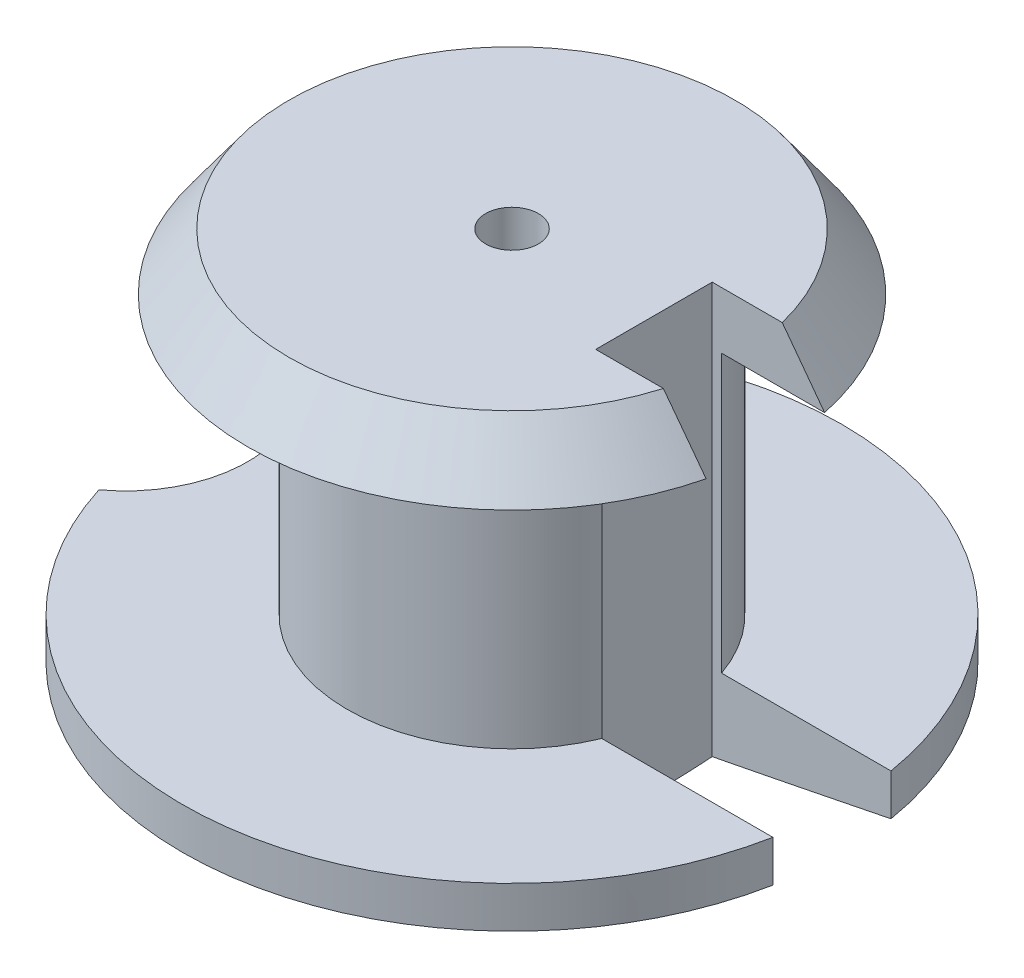
ISO-10303-21;
HEADER;
FILE_DESCRIPTION(('STEP AP214'),'2;1');
FILE_NAME('part.step','',(''),(''),'','','');
FILE_SCHEMA(('AUTOMOTIVE_DESIGN { 1 0 10303 214 1 1 1 1 }'));
ENDSEC;
DATA;
#1=APPLICATION_CONTEXT('core data for automotive mechanical design processes');
#2=APPLICATION_PROTOCOL_DEFINITION('international standard','automotive_design',2000,#1);
#3=PRODUCT_CONTEXT('',#1,'mechanical');
#4=PRODUCT('Part','Part','',(#3));
#5=PRODUCT_RELATED_PRODUCT_CATEGORY('part','',(#4));
#6=PRODUCT_DEFINITION_FORMATION('','',#4);
#7=PRODUCT_DEFINITION_CONTEXT('part definition',#1,'design');
#8=PRODUCT_DEFINITION('design','',#6,#7);
#9=PRODUCT_DEFINITION_SHAPE('','',#8);
#10=(LENGTH_UNIT() NAMED_UNIT(*) SI_UNIT(.MILLI.,.METRE.));
#11=(NAMED_UNIT(*) PLANE_ANGLE_UNIT() SI_UNIT($,.RADIAN.));
#12=(NAMED_UNIT(*) SI_UNIT($,.STERADIAN.) SOLID_ANGLE_UNIT());
#13=UNCERTAINTY_MEASURE_WITH_UNIT(LENGTH_MEASURE(1.E-05),#10,'distance_accuracy_value','');
#14=(GEOMETRIC_REPRESENTATION_CONTEXT(3) GLOBAL_UNCERTAINTY_ASSIGNED_CONTEXT((#13)) GLOBAL_UNIT_ASSIGNED_CONTEXT((#10,
#11,#12)) REPRESENTATION_CONTEXT('',''));
#15=CARTESIAN_POINT('',(0.,0.,0.));
#16=DIRECTION('',(0.,0.,1.));
#17=DIRECTION('',(1.,0.,0.));
#18=AXIS2_PLACEMENT_3D('',#15,#16,#17);
#19=CARTESIAN_POINT('',(0.,60.5928571428572,0.));
#20=DIRECTION('',(0.,1.,0.));
#21=DIRECTION('',(0.,0.,1.));
#22=AXIS2_PLACEMENT_3D('',#19,#20,#21);
#23=CYLINDRICAL_SURFACE('',#22,67.5801317233809);
#24=DIRECTION('',(0.,1.,0.));
#25=VECTOR('',#24,1.);
#26=CARTESIAN_POINT('',(66.6705314644081,60.5928571428572,-11.0505401679233));
#27=LINE('',#26,#25);
#28=CARTESIAN_POINT('',(66.6705314644081,-2.79285714285714,-11.0505401679233));
#29=VERTEX_POINT('',#28);
#30=CARTESIAN_POINT('',(66.6705314644081,5.70714285714287,-11.0505401679233));
#31=VERTEX_POINT('',#30);
#32=EDGE_CURVE('E278',#29,#31,#27,.T.);
#33=ORIENTED_EDGE('',*,*,#32,.F.);
#34=CARTESIAN_POINT('',(0.,-2.79285714285714,0.));
#35=DIRECTION('',(0.,1.,0.));
#36=DIRECTION('',(0.,0.,1.));
#37=AXIS2_PLACEMENT_3D('',#34,#35,#36);
#38=CIRCLE('',#37,67.5801317233809);
#39=CARTESIAN_POINT('',(-64.4810980958933,-2.79285714285714,-20.2302296600238));
#40=VERTEX_POINT('',#39);
#41=EDGE_CURVE('E250',#29,#40,#38,.T.);
#42=ORIENTED_EDGE('',*,*,#41,.T.);
#43=DIRECTION('',(0.,1.,0.));
#44=VECTOR('',#43,1.);
#45=CARTESIAN_POINT('',(-64.4810980958933,29.1928571428571,-20.2302296600238));
#46=LINE('',#45,#44);
#47=CARTESIAN_POINT('',(-64.4810980958932,5.70714285714287,-20.2302296600238));
#48=VERTEX_POINT('',#47);
#49=EDGE_CURVE('E62',#48,#40,#46,.F.);
#50=ORIENTED_EDGE('',*,*,#49,.F.);
#51=CARTESIAN_POINT('',(0.,5.70714285714287,0.));
#52=DIRECTION('',(0.,1.,0.));
#53=DIRECTION('',(0.,0.,1.));
#54=AXIS2_PLACEMENT_3D('',#51,#52,#53);
#55=CIRCLE('',#54,67.5801317233809);
#56=EDGE_CURVE('E249',#31,#48,#55,.T.);
#57=ORIENTED_EDGE('',*,*,#56,.F.);
#58=EDGE_LOOP('',(#33,#42,#50,#57));
#59=FACE_BOUND('',#58,.T.);
#60=ADVANCED_FACE('F33',(#59),#23,.T.);
#61=CARTESIAN_POINT('',(0.,74.1928571428572,0.));
#62=DIRECTION('',(0.,-1.,0.));
#63=DIRECTION('',(0.,0.,-1.));
#64=AXIS2_PLACEMENT_3D('',#61,#62,#63);
#65=CONICAL_SURFACE('',#64,45.722988866238,0.628659633119873);
#66=CARTESIAN_POINT('',(77.8188772758748,28.97457162678,-11.0505401679233));
#67=CARTESIAN_POINT('',(76.5001969646806,30.7702580252783,-11.0505401679233));
#68=CARTESIAN_POINT('',(75.1810927039574,32.5656329860975,-11.0505401679233));
#69=CARTESIAN_POINT('',(72.5418763796921,36.1556414404545,-11.0505401679233));
#70=CARTESIAN_POINT('',(71.2217643163512,37.9502749341401,-11.0505401679233));
#71=CARTESIAN_POINT('',(67.259866886022,43.3326267747084,-11.0505401679233));
#72=CARTESIAN_POINT('',(64.6163295079161,46.9190563567308,-11.0505401679233));
#73=CARTESIAN_POINT('',(60.6464061405652,52.2944523154025,-11.0505401679233));
#74=CARTESIAN_POINT('',(59.3225296152785,54.0852720505603,-11.0505401679233));
#75=CARTESIAN_POINT('',(56.672729250362,57.6653932521847,-11.0505401679233));
#76=CARTESIAN_POINT('',(55.3468054131388,59.4546947204323,-11.0505401679233));
#77=CARTESIAN_POINT('',(52.6923445341899,63.0315542363644,-11.0505401679233));
#78=CARTESIAN_POINT('',(51.3638073148415,64.8191121522593,-11.0505401679233));
#79=CARTESIAN_POINT('',(48.7035716013724,68.3918869338174,-11.0505401679233));
#80=CARTESIAN_POINT('',(47.3718730934286,70.1771037891909,-11.0505401679233));
#81=CARTESIAN_POINT('',(44.7036970493132,73.7455470876684,-11.0505401679233));
#82=CARTESIAN_POINT('',(43.3672172259683,75.5287718214047,-11.0505401679233));
#83=CARTESIAN_POINT('',(40.6890317443091,79.0912519826178,-11.0505401679233));
#84=CARTESIAN_POINT('',(39.3473261653528,80.8705074697309,-11.0505401679233));
#85=CARTESIAN_POINT('',(36.6571717878516,84.4233940875541,-11.0505401679233));
#86=CARTESIAN_POINT('',(35.3087243044728,86.1970262127705,-11.0505401679233));
#87=CARTESIAN_POINT('',(33.2787450234447,88.8519669243669,-11.0505401679233));
#88=CARTESIAN_POINT('',(32.6008477816158,89.7360544288525,-11.0505401679233));
#89=CARTESIAN_POINT('',(31.242145300257,91.5019914029704,-11.0505401679233));
#90=CARTESIAN_POINT('',(30.5613400642845,92.3838408753383,-11.0505401679233));
#91=CARTESIAN_POINT('',(29.1957885177706,94.1453962807452,-11.0505401679233));
#92=CARTESIAN_POINT('',(28.5110399464426,95.0251004621592,-11.0505401679233));
#93=CARTESIAN_POINT('',(27.1372679945755,96.7811565889434,-11.0505401679233));
#94=CARTESIAN_POINT('',(26.4482446450082,97.6575085585269,-11.0505401679233));
#95=CARTESIAN_POINT('',(25.065008983042,99.4058864763179,-11.0505401679233));
#96=CARTESIAN_POINT('',(24.3707975099521,100.277913087846,-11.0505401679233));
#97=CARTESIAN_POINT('',(22.9756843675237,102.016642982661,-11.0505401679233));
#98=CARTESIAN_POINT('',(22.2747825122343,102.883346116882,-11.0505401679233));
#99=CARTESIAN_POINT('',(20.863911781075,104.610411680541,-11.0505401679233));
#100=CARTESIAN_POINT('',(20.153936682409,105.470769040774,-11.0505401679233));
#101=CARTESIAN_POINT('',(19.0805368491413,106.754198542577,-11.0505401679233));
#102=CARTESIAN_POINT('',(18.7213429216361,107.18080973421,-11.0505401679233));
#103=CARTESIAN_POINT('',(17.9996728543956,108.031245262036,-11.0505401679233));
#104=CARTESIAN_POINT('',(17.6371967342818,108.455069614862,-11.0505401679233));
#105=CARTESIAN_POINT('',(16.9082138425939,109.299654263282,-11.0505401679233));
#106=CARTESIAN_POINT('',(16.5417049330485,109.72041271548,-11.0505401679233));
#107=CARTESIAN_POINT('',(15.8041868054859,110.557953541547,-11.0505401679233));
#108=CARTESIAN_POINT('',(15.4331776916075,110.974736007027,-11.0505401679233));
#109=CARTESIAN_POINT('',(14.6857099291161,111.803593656862,-11.0505401679233));
#110=CARTESIAN_POINT('',(14.3092498903325,112.215667590674,-11.0505401679233));
#111=CARTESIAN_POINT('',(13.7397310057592,112.829325431941,-11.0505401679233));
#112=CARTESIAN_POINT('',(13.5490787318866,113.033144056626,-11.0505401679233));
#113=CARTESIAN_POINT('',(13.165998150429,113.439111204285,-11.0505401679233));
#114=CARTESIAN_POINT('',(12.9735698137177,113.641259699766,-11.0505401679233));
#115=CARTESIAN_POINT('',(12.7801709211696,113.842479793958,-11.0505401679233));
#116=B_SPLINE_CURVE_WITH_KNOTS('',3,(#66,#67,#68,#69,#70,#71,#72,#73,#74,#75,#76,#77,#78,#79,
#80,#81,#82,#83,#84,#85,#86,#87,#88,#89,#90,#91,#92,#93,#94,#95,#96,#97,#98,#99,#100,#101,#102,
#103,#104,#105,#106,#107,#108,#109,#110,#111,#112,#113,#114,#115),.UNSPECIFIED.,.F.,.F.,(4,2,2,
2,2,2,2,2,2,2,2,2,2,2,2,2,2,2,2,2,2,2,2,2,4),(0.,6.68361150316541,13.367221672458,
26.7334748716227,33.4145784405643,40.0956741617033,46.7772408503805,53.4588368090567,
60.1442326678207,66.829527395212,73.5135652691268,76.8557751876516,80.1979810188978,
83.5423447836274,86.8866843459043,90.230494109611,93.5743970825988,96.9207317042379,
98.5937865543738,100.266831409297,101.940810621383,103.614751169761,105.289126424257,
106.126382063349,106.963651457355),.UNSPECIFIED.);
#117=CARTESIAN_POINT('',(53.059969113713,62.5357142857143,-11.0505401679233));
#118=VERTEX_POINT('',#117);
#119=CARTESIAN_POINT('',(44.3675249800937,74.1928571428572,-11.0505401679233));
#120=VERTEX_POINT('',#119);
#121=EDGE_CURVE('E140',#118,#120,#116,.T.);
#122=ORIENTED_EDGE('',*,*,#121,.F.);
#123=CARTESIAN_POINT('',(0.,62.5357142857143,0.));
#124=DIRECTION('',(0.,1.,0.));
#125=DIRECTION('',(0.,0.,1.));
#126=AXIS2_PLACEMENT_3D('',#123,#124,#125);
#127=CIRCLE('',#126,54.1984756275586);
#128=CARTESIAN_POINT('',(-54.1984756275586,62.5357142857143,0.));
#129=VERTEX_POINT('',#128);
#130=EDGE_CURVE('E144',#118,#129,#127,.T.);
#131=ORIENTED_EDGE('',*,*,#130,.T.);
#132=CARTESIAN_POINT('',(52.6537718601297,62.5357142857143,12.8473759675849));
#133=VERTEX_POINT('',#132);
#134=EDGE_CURVE('E55',#129,#133,#127,.T.);
#135=ORIENTED_EDGE('',*,*,#134,.T.);
#136=CARTESIAN_POINT('',(11.7924927436411,113.094546721231,12.8473759675849));
#137=CARTESIAN_POINT('',(11.9611827414405,112.937649544372,12.8473759675849));
#138=CARTESIAN_POINT('',(12.1289641842511,112.779780735433,12.8473759675849));
#139=CARTESIAN_POINT('',(12.4628369898428,112.462272621105,12.8473759675849));
#140=CARTESIAN_POINT('',(12.6289283891408,112.302633354128,12.8473759675849));
#141=CARTESIAN_POINT('',(13.1248306843208,111.821345886943,12.8473759675849));
#142=CARTESIAN_POINT('',(13.4523086664141,111.497291622457,12.8473759675849));
#143=CARTESIAN_POINT('',(14.1017689047759,110.843997527715,12.8473759675849));
#144=CARTESIAN_POINT('',(14.4237533329263,110.514759850587,12.8473759675849));
#145=CARTESIAN_POINT('',(15.0630920285601,109.851803631581,12.8473759675849));
#146=CARTESIAN_POINT('',(15.3804461457757,109.518084944952,12.8473759675849));
#147=CARTESIAN_POINT('',(16.0108003695767,108.847187474655,12.8473759675849));
#148=CARTESIAN_POINT('',(16.3238044794679,108.510012447846,12.8473759675849));
#149=CARTESIAN_POINT('',(16.9462790574504,107.832413867375,12.8473759675849));
#150=CARTESIAN_POINT('',(17.2557494892547,107.49199028042,12.8473759675849));
#151=CARTESIAN_POINT('',(18.1795760730316,106.466460351004,12.8473759675849));
#152=CARTESIAN_POINT('',(18.7892829784361,105.777163918532,12.8473759675849));
#153=CARTESIAN_POINT('',(19.9980970182898,104.391083100738,12.8473759675849));
#154=CARTESIAN_POINT('',(20.5972179172421,103.694310676746,12.8473759675849));
#155=CARTESIAN_POINT('',(21.7876482130091,102.294184638824,12.8473759675849));
#156=CARTESIAN_POINT('',(22.3789579474581,101.590831311611,12.8473759675849));
#157=CARTESIAN_POINT('',(23.5554252713095,100.17864789686,12.8473759675849));
#158=CARTESIAN_POINT('',(24.140580961836,99.4698162295834,12.8473759675849));
#159=CARTESIAN_POINT('',(25.3056783611006,98.0478706747403,12.8473759675849));
#160=CARTESIAN_POINT('',(25.8856200068548,97.334756735618,12.8473759675849));
#161=CARTESIAN_POINT('',(27.2873928260413,95.6003613899229,12.8473759675849));
#162=CARTESIAN_POINT('',(28.10697913295,94.5772663137864,12.8473759675849));
#163=CARTESIAN_POINT('',(29.7392240307514,92.5255730556456,12.8473759675849));
#164=CARTESIAN_POINT('',(30.5518826220971,91.4969748740012,12.8473759675849));
#165=CARTESIAN_POINT('',(32.1715662450453,89.4355326860797,12.8473759675849));
#166=CARTESIAN_POINT('',(32.9785918675616,88.4026891437779,12.8473759675849));
#167=CARTESIAN_POINT('',(34.5881353548519,86.3334989402011,12.8473759675849));
#168=CARTESIAN_POINT('',(35.3906532223023,85.2971522810065,12.8473759675849));
#169=CARTESIAN_POINT('',(36.9927118729678,83.2206428675445,12.8473759675849));
#170=CARTESIAN_POINT('',(37.7922492449911,82.1804774826276,12.8473759675849));
#171=CARTESIAN_POINT('',(39.3882188556856,80.0977683860309,12.8473759675849));
#172=CARTESIAN_POINT('',(40.1846510944571,79.0552246744278,12.8473759675849));
#173=CARTESIAN_POINT('',(42.5700930562891,75.9245695495507,12.8473759675849));
#174=CARTESIAN_POINT('',(44.1552059412319,73.8334888100817,12.8473759675849));
#175=CARTESIAN_POINT('',(47.0801696897094,69.9603793084909,12.8473759675849));
#176=CARTESIAN_POINT('',(48.4210715977827,68.1791432563111,12.8473759675849));
#177=CARTESIAN_POINT('',(51.0985798120101,64.6134440564357,12.8473759675849));
#178=CARTESIAN_POINT('',(52.4351861152443,62.8289809065478,12.8473759675849));
#179=CARTESIAN_POINT('',(55.1049632028743,59.2575089233623,12.8473759675849));
#180=CARTESIAN_POINT('',(56.4381340137099,57.4705001098217,12.8473759675849));
#181=CARTESIAN_POINT('',(59.1016964067597,53.8944123107186,12.8473759675849));
#182=CARTESIAN_POINT('',(60.4320879884549,52.1053333247697,12.8473759675849));
#183=CARTESIAN_POINT('',(63.0881596108778,48.5287462209139,12.8473759675849));
#184=CARTESIAN_POINT('',(64.4138438190622,46.7412411973167,12.8473759675849));
#185=CARTESIAN_POINT('',(67.0633162743649,43.1648263282357,12.8473759675849));
#186=CARTESIAN_POINT('',(68.3871045211879,41.3759164825332,12.8473759675849));
#187=CARTESIAN_POINT('',(71.0330871198931,37.7969207288258,12.8473759675849));
#188=CARTESIAN_POINT('',(72.3552814730195,36.0068348217405,12.8473759675849));
#189=CARTESIAN_POINT('',(74.9983072308581,32.425658368256,12.8473759675849));
#190=CARTESIAN_POINT('',(76.3191386362139,30.6345678223316,12.8473759675849));
#191=CARTESIAN_POINT('',(77.6394041475225,28.8430605205947,12.8473759675849));
#192=B_SPLINE_CURVE_WITH_KNOTS('',3,(#136,#137,#138,#139,#140,#141,#142,#143,#144,#145,#146,
#147,#148,#149,#150,#151,#152,#153,#154,#155,#156,#157,#158,#159,#160,#161,#162,#163,#164,#165,
#166,#167,#168,#169,#170,#171,#172,#173,#174,#175,#176,#177,#178,#179,#180,#181,#182,#183,#184,
#185,#186,#187,#188,#189,#190,#191),.UNSPECIFIED.,.F.,.F.,(4,2,2,2,2,2,2,2,2,2,2,2,2,2,2,2,2,2,
2,2,2,2,2,2,2,2,2,4),(0.,0.691118032866615,1.38222110078003,2.76426725210579,4.14575372030342,
5.52728492267877,6.90744697244064,8.28762318221191,11.0482591556192,13.8049929979626,
16.5616072891704,19.3190485708605,22.0765231169355,26.0091661125954,29.9418088510773,
33.8740326499614,37.8062541138941,41.7420870598992,45.6779198787959,53.5497924742025,
60.2383866421584,66.9269853555854,73.6155324381313,80.3040807692711,86.9804192732339,
93.6567588170886,100.333093146493,107.009424321852),.UNSPECIFIED.);
#193=CARTESIAN_POINT('',(43.88093710952,74.1928571428572,12.8473759675849));
#194=VERTEX_POINT('',#193);
#195=EDGE_CURVE('E272',#194,#133,#192,.T.);
#196=ORIENTED_EDGE('',*,*,#195,.F.);
#197=CARTESIAN_POINT('',(0.,74.1928571428572,0.));
#198=DIRECTION('',(0.,1.,0.));
#199=DIRECTION('',(0.,0.,1.));
#200=AXIS2_PLACEMENT_3D('',#197,#198,#199);
#201=CIRCLE('',#200,45.722988866238);
#202=EDGE_CURVE('E285',#120,#194,#201,.T.);
#203=ORIENTED_EDGE('',*,*,#202,.F.);
#204=EDGE_LOOP('',(#122,#131,#135,#196,#203));
#205=FACE_BOUND('',#204,.T.);
#206=ADVANCED_FACE('F35',(#205),#65,.T.);
#207=CARTESIAN_POINT('',(-33.7900658616904,62.5357142857143,0.));
#208=DIRECTION('',(0.,-1.,0.));
#209=DIRECTION('',(0.,0.,-1.));
#210=AXIS2_PLACEMENT_3D('',#207,#208,#209);
#211=PLANE('',#210);
#212=DIRECTION('',(1.,0.,0.));
#213=VECTOR('',#212,1.);
#214=CARTESIAN_POINT('',(-33.7900658616904,62.5357142857143,-11.0505401679233));
#215=LINE('',#214,#213);
#216=CARTESIAN_POINT('',(31.9320233141355,62.5357142857143,-11.0505401679233));
#217=VERTEX_POINT('',#216);
#218=EDGE_CURVE('E263',#217,#118,#215,.T.);
#219=ORIENTED_EDGE('',*,*,#218,.F.);
#220=CARTESIAN_POINT('',(0.,62.5357142857143,0.));
#221=DIRECTION('',(0.,1.,0.));
#222=DIRECTION('',(0.,0.,1.));
#223=AXIS2_PLACEMENT_3D('',#220,#221,#222);
#224=CIRCLE('',#223,33.7900658616904);
#225=CARTESIAN_POINT('',(31.2524156135954,62.5357142857143,12.8473759675849));
#226=VERTEX_POINT('',#225);
#227=EDGE_CURVE('E258',#217,#226,#224,.T.);
#228=ORIENTED_EDGE('',*,*,#227,.T.);
#229=DIRECTION('',(-1.,0.,0.));
#230=VECTOR('',#229,1.);
#231=CARTESIAN_POINT('',(-33.7900658616904,62.5357142857143,12.8473759675849));
#232=LINE('',#231,#230);
#233=EDGE_CURVE('E270',#133,#226,#232,.T.);
#234=ORIENTED_EDGE('',*,*,#233,.F.);
#235=ORIENTED_EDGE('',*,*,#134,.F.);
#236=ORIENTED_EDGE('',*,*,#130,.F.);
#237=EDGE_LOOP('',(#219,#228,#234,#235,#236));
#238=FACE_BOUND('',#237,.T.);
#239=ADVANCED_FACE('F220',(#238),#211,.T.);
#240=CARTESIAN_POINT('',(0.,60.5928571428572,0.));
#241=DIRECTION('',(0.,1.,0.));
#242=DIRECTION('',(0.,0.,1.));
#243=AXIS2_PLACEMENT_3D('',#240,#241,#242);
#244=CYLINDRICAL_SURFACE('',#243,33.7900658616904);
#245=DIRECTION('',(0.,1.,0.));
#246=VECTOR('',#245,1.);
#247=CARTESIAN_POINT('',(31.9320233141355,60.5928571428572,-11.0505401679233));
#248=LINE('',#247,#246);
#249=CARTESIAN_POINT('',(31.9320233141355,5.70714285714287,-11.0505401679233));
#250=VERTEX_POINT('',#249);
#251=EDGE_CURVE('E265',#250,#217,#248,.T.);
#252=ORIENTED_EDGE('',*,*,#251,.F.);
#253=CARTESIAN_POINT('',(0.,5.70714285714287,0.));
#254=DIRECTION('',(0.,1.,0.));
#255=DIRECTION('',(0.,0.,1.));
#256=AXIS2_PLACEMENT_3D('',#253,#254,#255);
#257=CIRCLE('',#256,33.7900658616904);
#258=CARTESIAN_POINT('',(31.2524156135954,5.70714285714287,12.8473759675849));
#259=VERTEX_POINT('',#258);
#260=EDGE_CURVE('E252',#250,#259,#257,.T.);
#261=ORIENTED_EDGE('',*,*,#260,.T.);
#262=DIRECTION('',(0.,1.,0.));
#263=VECTOR('',#262,1.);
#264=CARTESIAN_POINT('',(31.2524156135954,60.5928571428572,12.8473759675849));
#265=LINE('',#264,#263);
#266=EDGE_CURVE('E269',#226,#259,#265,.F.);
#267=ORIENTED_EDGE('',*,*,#266,.F.);
#268=ORIENTED_EDGE('',*,*,#227,.F.);
#269=EDGE_LOOP('',(#252,#261,#267,#268));
#270=FACE_BOUND('',#269,.T.);
#271=ADVANCED_FACE('F229',(#270),#244,.T.);
#272=CARTESIAN_POINT('',(-67.5801317233809,5.70714285714287,0.));
#273=DIRECTION('',(0.,1.,0.));
#274=DIRECTION('',(0.,0.,1.));
#275=AXIS2_PLACEMENT_3D('',#272,#273,#274);
#276=PLANE('',#275);
#277=DIRECTION('',(-1.,0.,0.));
#278=VECTOR('',#277,1.);
#279=CARTESIAN_POINT('',(-67.5801317233809,5.70714285714287,-11.0505401679233));
#280=LINE('',#279,#278);
#281=EDGE_CURVE('E279',#31,#250,#280,.T.);
#282=ORIENTED_EDGE('',*,*,#281,.F.);
#283=ORIENTED_EDGE('',*,*,#56,.T.);
#284=CARTESIAN_POINT('',(-79.2404587651061,5.70714285714287,0.));
#285=DIRECTION('',(0.,1.,0.));
#286=DIRECTION('',(0.,0.,1.));
#287=AXIS2_PLACEMENT_3D('',#284,#285,#286);
#288=CIRCLE('',#287,25.0419831375475);
#289=CARTESIAN_POINT('',(-64.4810980958933,5.70714285714287,20.2302296600237));
#290=VERTEX_POINT('',#289);
#291=EDGE_CURVE('E248',#290,#48,#288,.T.);
#292=ORIENTED_EDGE('',*,*,#291,.F.);
#293=CARTESIAN_POINT('',(66.3477138603662,5.70714285714287,12.8473759675849));
#294=VERTEX_POINT('',#293);
#295=EDGE_CURVE('E236',#290,#294,#55,.T.);
#296=ORIENTED_EDGE('',*,*,#295,.T.);
#297=DIRECTION('',(1.,0.,0.));
#298=VECTOR('',#297,1.);
#299=CARTESIAN_POINT('',(-67.5801317233809,5.70714285714287,12.8473759675849));
#300=LINE('',#299,#298);
#301=EDGE_CURVE('E241',#259,#294,#300,.T.);
#302=ORIENTED_EDGE('',*,*,#301,.F.);
#303=ORIENTED_EDGE('',*,*,#260,.F.);
#304=EDGE_LOOP('',(#282,#283,#292,#296,#302,#303));
#305=FACE_BOUND('',#304,.T.);
#306=ADVANCED_FACE('F224',(#305),#276,.T.);
#307=DIRECTION('',(0.,1.,0.));
#308=VECTOR('',#307,1.);
#309=CARTESIAN_POINT('',(66.3477138603662,60.5928571428572,12.8473759675849));
#310=LINE('',#309,#308);
#311=CARTESIAN_POINT('',(66.3477138603662,-2.79285714285714,12.8473759675849));
#312=VERTEX_POINT('',#311);
#313=EDGE_CURVE('E159',#294,#312,#310,.F.);
#314=ORIENTED_EDGE('',*,*,#313,.F.);
#315=ORIENTED_EDGE('',*,*,#295,.F.);
#316=DIRECTION('',(0.,1.,0.));
#317=VECTOR('',#316,1.);
#318=CARTESIAN_POINT('',(-64.4810980958933,29.1928571428571,20.2302296600238));
#319=LINE('',#318,#317);
#320=CARTESIAN_POINT('',(-64.4810980958933,-2.79285714285714,20.2302296600238));
#321=VERTEX_POINT('',#320);
#322=EDGE_CURVE('E284',#321,#290,#319,.T.);
#323=ORIENTED_EDGE('',*,*,#322,.F.);
#324=EDGE_CURVE('E238',#321,#312,#38,.T.);
#325=ORIENTED_EDGE('',*,*,#324,.T.);
#326=EDGE_LOOP('',(#314,#315,#323,#325));
#327=FACE_BOUND('',#326,.T.);
#328=ADVANCED_FACE('F171',(#327),#23,.T.);
#329=CARTESIAN_POINT('',(0.,-2.79285714285714,0.));
#330=DIRECTION('',(0.,1.,0.));
#331=DIRECTION('',(0.,0.,1.));
#332=AXIS2_PLACEMENT_3D('',#329,#330,#331);
#333=CONICAL_SURFACE('',#332,67.5801317233809,1.36875493223706);
#334=CARTESIAN_POINT('',(-0.442125760313382,-14.370352698641,-11.0505401679233));
#335=CARTESIAN_POINT('',(-0.207767102952896,-14.3722770712849,-11.0505401679233));
#336=CARTESIAN_POINT('',(0.0266015412856308,-14.372666947091,-11.0505401679233));
#337=CARTESIAN_POINT('',(0.495321848044679,-14.3703982241092,-11.0505401679233));
#338=CARTESIAN_POINT('',(0.729673510707715,-14.3677396548533,-11.0505401679233));
#339=CARTESIAN_POINT('',(1.43257615476579,-14.355223461927,-11.0505401679233));
#340=CARTESIAN_POINT('',(1.9010530764081,-14.3408259818417,-11.0505401679233));
#341=CARTESIAN_POINT('',(2.83696989178938,-14.3006401747236,-11.0505401679233));
#342=CARTESIAN_POINT('',(3.30441035892761,-14.2748648445232,-11.0505401679233));
#343=CARTESIAN_POINT('',(4.23862253823752,-14.2130569733121,-11.0505401679233));
#344=CARTESIAN_POINT('',(4.70539422474623,-14.1770240487514,-11.0505401679233));
#345=CARTESIAN_POINT('',(5.63712766382263,-14.0961263564295,-11.0505401679233));
#346=CARTESIAN_POINT('',(6.10209113898305,-14.0512811963273,-11.0505401679233));
#347=CARTESIAN_POINT('',(7.03121983265391,-13.9540577064979,-11.0505401679233));
#348=CARTESIAN_POINT('',(7.49538505627411,-13.9016794251747,-11.0505401679233));
#349=CARTESIAN_POINT('',(8.42311615375236,-13.7906171492578,-11.0505401679233));
#350=CARTESIAN_POINT('',(8.886681768403,-13.7319310046527,-11.0505401679233));
#351=CARTESIAN_POINT('',(9.81312094078032,-13.6093556920621,-11.0505401679233));
#352=CARTESIAN_POINT('',(10.27599449822,-13.5454665219192,-11.0505401679233));
#353=CARTESIAN_POINT('',(11.2398616038532,-13.4078725361291,-11.0505401679233));
#354=CARTESIAN_POINT('',(11.7408015691014,-13.3337937717562,-11.0505401679233));
#355=CARTESIAN_POINT('',(12.7420623916555,-13.1815532998078,-11.0505401679233));
#356=CARTESIAN_POINT('',(13.2423832437475,-13.1033915580842,-11.0505401679233));
#357=CARTESIAN_POINT('',(14.2425070113765,-12.943743006266,-11.0505401679233));
#358=CARTESIAN_POINT('',(14.7423099121299,-12.8622561038047,-11.0505401679233));
#359=CARTESIAN_POINT('',(15.7414644418578,-12.6965571919591,-11.0505401679233));
#360=CARTESIAN_POINT('',(16.2408160692435,-12.6123451730177,-11.0505401679233));
#361=CARTESIAN_POINT('',(17.7382520207969,-12.3563729733125,-11.0505401679233));
#362=CARTESIAN_POINT('',(18.735764449159,-12.1812690412891,-11.0505401679233));
#363=CARTESIAN_POINT('',(20.729688834635,-11.8249046888644,-11.0505401679233));
#364=CARTESIAN_POINT('',(21.7261007845495,-11.6436442284308,-11.0505401679233));
#365=CARTESIAN_POINT('',(23.2209592816169,-11.3682758668734,-11.0505401679233));
#366=CARTESIAN_POINT('',(23.719712154046,-11.2758262509088,-11.0505401679233));
#367=CARTESIAN_POINT('',(24.7170380577801,-11.0899713937832,-11.0505401679233));
#368=CARTESIAN_POINT('',(25.2156110896909,-10.9965661558726,-11.0505401679233));
#369=CARTESIAN_POINT('',(26.7111047291657,-10.7151255424718,-11.0505401679233));
#370=CARTESIAN_POINT('',(27.7077949831907,-10.5258661723533,-11.0505401679233));
#371=CARTESIAN_POINT('',(29.7006707842962,-10.1449064871194,-11.0505401679233));
#372=CARTESIAN_POINT('',(30.6968563482816,-9.95320626027766,-11.0505401679233));
#373=CARTESIAN_POINT('',(32.6888624306713,-9.56791904581037,-11.0505401679233));
#374=CARTESIAN_POINT('',(33.6846829490276,-9.37433205793761,-11.0505401679233));
#375=CARTESIAN_POINT('',(36.1848825646856,-8.88637695650993,-11.0505401679233));
#376=CARTESIAN_POINT('',(37.6890773086853,-8.59106467956198,-11.0505401679233));
#377=CARTESIAN_POINT('',(40.6969961262704,-7.99805049008049,-11.0505401679233));
#378=CARTESIAN_POINT('',(42.2007201995444,-7.70034857596992,-11.0505401679233));
#379=CARTESIAN_POINT('',(45.2078334121723,-7.10317643024769,-11.0505401679233));
#380=CARTESIAN_POINT('',(46.7112225478488,-6.80370618012693,-11.0505401679233));
#381=CARTESIAN_POINT('',(49.7177333943282,-6.20342613676738,-11.0505401679233));
#382=CARTESIAN_POINT('',(51.2208551051042,-5.9026163433941,-11.0505401679233));
#383=CARTESIAN_POINT('',(55.7270921524925,-4.99921469123453,-11.0505401679233));
#384=CARTESIAN_POINT('',(58.7298999535377,-4.39508910102804,-11.0505401679233));
#385=CARTESIAN_POINT('',(64.7349844494342,-3.18426565920763,-11.0505401679233));
#386=CARTESIAN_POINT('',(67.7372611462687,-2.57756781741968,-11.0505401679233));
#387=CARTESIAN_POINT('',(73.9260073964207,-1.32507967177774,-11.0505401679233));
#388=CARTESIAN_POINT('',(77.1124545845711,-0.679178878633441,-11.0505401679233));
#389=CARTESIAN_POINT('',(83.485073389726,0.613980922462998,-11.0505401679233));
#390=CARTESIAN_POINT('',(86.671245006719,1.26123993047146,-11.0505401679233));
#391=CARTESIAN_POINT('',(96.229477826509,3.20445984577881,-11.0505401679233));
#392=CARTESIAN_POINT('',(102.601246096916,4.5018614349532,-11.0505401679233));
#393=CARTESIAN_POINT('',(115.35445415852,7.10086755167422,-11.0505401679233));
#394=CARTESIAN_POINT('',(121.735893255971,8.40247548164571,-11.0505401679233));
#395=CARTESIAN_POINT('',(131.307837383978,10.3559053176397,-11.0505401679233));
#396=CARTESIAN_POINT('',(134.498446427604,11.0072175899813,-11.0505401679233));
#397=CARTESIAN_POINT('',(140.879607391589,12.3101216962733,-11.0505401679233));
#398=CARTESIAN_POINT('',(144.070159311948,12.9617135302202,-11.0505401679233));
#399=CARTESIAN_POINT('',(147.260688821493,13.6134150572989,-11.0505401679233));
#400=B_SPLINE_CURVE_WITH_KNOTS('',3,(#334,#335,#336,#337,#338,#339,#340,#341,#342,#343,#344,
#345,#346,#347,#348,#349,#350,#351,#352,#353,#354,#355,#356,#357,#358,#359,#360,#361,#362,#363,
#364,#365,#366,#367,#368,#369,#370,#371,#372,#373,#374,#375,#376,#377,#378,#379,#380,#381,#382,
#383,#384,#385,#386,#387,#388,#389,#390,#391,#392,#393,#394,#395,#396,#397,#398,#399),
.UNSPECIFIED.,.F.,.F.,(4,2,2,2,2,2,2,2,2,2,2,2,2,2,2,2,2,2,2,2,2,2,2,2,2,2,2,2,2,2,2,2,4),(0.,
0.703089580166051,1.40617234916822,2.81210309957985,4.21643200508473,5.62081342787193,
7.02210471093479,8.42338699041926,9.82514841544812,11.2269104217181,12.74605249814,
14.2652072819796,15.7844042938171,17.3036066340415,20.3418683818933,23.3801498895694,
24.9018955179632,26.4236359720014,29.4671318206169,32.5105179118975,35.553904401914,
40.1526295526878,44.7513577386259,49.3501341448873,53.9489110128225,63.1378370914522,
72.3267281000194,82.080480847374,91.8342339992227,111.341773671445,130.880262032411,
140.649486334506,150.418710509175),.UNSPECIFIED.);
#401=CARTESIAN_POINT('',(30.0071578543599,-10.0856178045799,-11.0505401679233));
#402=VERTEX_POINT('',#401);
#403=EDGE_CURVE('E179',#402,#29,#400,.T.);
#404=ORIENTED_EDGE('',*,*,#403,.F.);
#405=CARTESIAN_POINT('',(30.0071578543599,-8.82399322391365,23.5363058494129));
#406=CARTESIAN_POINT('',(30.0071578543599,-8.90668019226419,22.8821801359649));
#407=CARTESIAN_POINT('',(30.0071578543599,-8.98727764646795,22.2277871821114));
#408=CARTESIAN_POINT('',(30.0071578543599,-9.14383688488105,20.9184572453568));
#409=CARTESIAN_POINT('',(30.0071578543599,-9.21979873698025,20.2635202705654));
#410=CARTESIAN_POINT('',(30.0071578543599,-9.36664427377892,18.952969205559));
#411=CARTESIAN_POINT('',(30.0071578543599,-9.43752714761562,18.297355024101));
#412=CARTESIAN_POINT('',(30.0071578543599,-9.57371182468535,16.9855315120624));
#413=CARTESIAN_POINT('',(30.0071578543599,-9.63901348028669,16.3293221662026));
#414=CARTESIAN_POINT('',(30.0071578543599,-9.82585133681346,14.3590916530285));
#415=CARTESIAN_POINT('',(30.0071578543599,-9.93823919148531,13.0441831603324));
#416=CARTESIAN_POINT('',(30.0071578543599,-10.1344842994621,10.4122543200969));
#417=CARTESIAN_POINT('',(30.0071578543599,-10.2183423622824,9.09523403354401));
#418=CARTESIAN_POINT('',(30.0071578543599,-10.3533405181458,6.46826085367024));
#419=CARTESIAN_POINT('',(30.0071578543599,-10.4046942300124,5.1583191224425));
#420=CARTESIAN_POINT('',(30.0071578543599,-10.4729696542055,2.53751835337371));
#421=CARTESIAN_POINT('',(30.0071578543599,-10.4898912412204,1.2266593122116));
#422=CARTESIAN_POINT('',(30.0071578543599,-10.4883850908879,-1.39449718486058));
#423=CARTESIAN_POINT('',(30.0071578543599,-10.469971937748,-2.7047946492929));
#424=CARTESIAN_POINT('',(30.0071578543599,-10.3988206229397,-5.32444684006777));
#425=CARTESIAN_POINT('',(30.0071578543599,-10.3460823058072,-6.6338015621136));
#426=CARTESIAN_POINT('',(30.0071578543599,-10.209185379633,-9.24592688339857));
#427=CARTESIAN_POINT('',(30.0071578543599,-10.1251451066535,-10.5487037837913));
#428=CARTESIAN_POINT('',(30.0071578543599,-9.92926911142209,-13.1521730186397));
#429=CARTESIAN_POINT('',(30.0071578543599,-9.81743265892369,-14.4528652974256));
#430=CARTESIAN_POINT('',(30.0071578543599,-9.56991889243993,-17.0526162003711));
#431=CARTESIAN_POINT('',(30.0071578543599,-9.43422959656611,-18.3516736714544));
#432=CARTESIAN_POINT('',(30.0071578543599,-9.14293832455142,-20.9475316824023));
#433=CARTESIAN_POINT('',(30.0071578543599,-8.98733639950532,-22.2443322280494));
#434=CARTESIAN_POINT('',(30.0071578543599,-8.65851124535699,-24.8451968369354));
#435=CARTESIAN_POINT('',(30.0071578543599,-8.48516890220141,-26.1492457429934));
#436=CARTESIAN_POINT('',(30.0071578543599,-8.12482194514511,-28.7554567163383));
#437=CARTESIAN_POINT('',(30.0071578543599,-7.93781720563278,-30.0576187661651));
#438=CARTESIAN_POINT('',(30.0071578543599,-7.55286288967832,-32.6587359447434));
#439=CARTESIAN_POINT('',(30.0071578543599,-7.35492659544998,-33.957693045673));
#440=CARTESIAN_POINT('',(30.0071578543599,-7.05116638609888,-35.90502656582));
#441=CARTESIAN_POINT('',(30.0071578543599,-6.94877247645785,-36.5539410524686));
#442=CARTESIAN_POINT('',(30.0071578543599,-6.74190321294386,-37.8514360821499));
#443=CARTESIAN_POINT('',(30.0071578543599,-6.63742786594065,-38.5000166262775));
#444=CARTESIAN_POINT('',(30.0071578543599,-6.53201395216142,-39.1484447052135));
#445=B_SPLINE_CURVE_WITH_KNOTS('',3,(#405,#406,#407,#408,#409,#410,#411,#412,#413,#414,#415,
#416,#417,#418,#419,#420,#421,#422,#423,#424,#425,#426,#427,#428,#429,#430,#431,#432,#433,#434,
#435,#436,#437,#438,#439,#440,#441,#442,#443,#444),.UNSPECIFIED.,.F.,.F.,(4,2,2,2,2,2,2,2,2,2,2,
2,2,2,2,2,2,2,2,4),(0.,1.97799450907167,3.95596004283385,5.93424065994359,7.91257358939557,
11.871398391663,15.8301108553246,19.7625288538195,23.6949611638433,27.6257707345077,
31.5565981085542,35.4727135023856,39.3889317892169,43.3071229427334,47.2253040425797,
51.1717742869934,55.1182808196842,59.0600934210506,61.0309207022331,63.0017414798167),.UNSPECIFIED.);
#446=CARTESIAN_POINT('',(30.0071578543599,-9.94950001869438,12.8473759675849));
#447=VERTEX_POINT('',#446);
#448=EDGE_CURVE('E131',#447,#402,#445,.T.);
#449=ORIENTED_EDGE('',*,*,#448,.F.);
#450=CARTESIAN_POINT('',(-0.50583192567498,-14.002067707382,12.8473759675849));
#451=CARTESIAN_POINT('',(-0.233371246097891,-14.0042713945492,12.8473759675849));
#452=CARTESIAN_POINT('',(0.0391033590059542,-14.0046881220641,12.8473759675849));
#453=CARTESIAN_POINT('',(0.584032353325779,-14.0019776814277,12.8473759675849));
#454=CARTESIAN_POINT('',(0.856486742712783,-13.9988505477865,12.8473759675849));
#455=CARTESIAN_POINT('',(1.40129225376281,-13.9890831726077,12.8473759675849));
#456=CARTESIAN_POINT('',(1.67364338473949,-13.9824434507494,12.8473759675849));
#457=CARTESIAN_POINT('',(2.21823941130127,-13.9657379686681,12.8473759675849));
#458=CARTESIAN_POINT('',(2.49048430669449,-13.9556722022858,12.8473759675849));
#459=CARTESIAN_POINT('',(3.30639956741098,-13.9205328565537,12.8473759675849));
#460=CARTESIAN_POINT('',(3.84986260987242,-13.8905057702799,12.8473759675849));
#461=CARTESIAN_POINT('',(4.93600163111146,-13.8185292690447,12.8473759675849));
#462=CARTESIAN_POINT('',(5.47867757978702,-13.7765794095886,12.8473759675849));
#463=CARTESIAN_POINT('',(6.56188359783389,-13.6824244184045,12.8473759675849));
#464=CARTESIAN_POINT('',(7.10241573849675,-13.6302428952308,12.8473759675849));
#465=CARTESIAN_POINT('',(8.18255149643521,-13.5171297672006,12.8473759675849));
#466=CARTESIAN_POINT('',(8.72215511961081,-13.4561982181528,12.8473759675849));
#467=CARTESIAN_POINT('',(9.800658259452,-13.3270138631426,12.8473759675849));
#468=CARTESIAN_POINT('',(10.3395574883709,-13.2587586709907,12.8473759675849));
#469=CARTESIAN_POINT('',(11.4165512680016,-13.1162012707827,12.8473759675849));
#470=CARTESIAN_POINT('',(11.9546458177029,-13.0418990551394,12.8473759675849));
#471=CARTESIAN_POINT('',(13.4202232076588,-12.8326318152168,12.8473759675849));
#472=CARTESIAN_POINT('',(14.3470045336077,-12.6927620842908,12.8473759675849));
#473=CARTESIAN_POINT('',(16.1989102875819,-12.4024604464503,12.8473759675849));
#474=CARTESIAN_POINT('',(17.1240346832684,-12.2520283356417,12.8473759675849));
#475=CARTESIAN_POINT('',(18.9729318269686,-11.9434893686386,12.8473759675849));
#476=CARTESIAN_POINT('',(19.8967046642853,-11.78538304551,12.8473759675849));
#477=CARTESIAN_POINT('',(21.7432484765344,-11.4634919072656,12.8473759675849));
#478=CARTESIAN_POINT('',(22.6660194598805,-11.2997071402253,12.8473759675849));
#479=CARTESIAN_POINT('',(24.5120773518258,-10.9676260272957,12.8473759675849));
#480=CARTESIAN_POINT('',(25.4353631825558,-10.7993237028417,12.8473759675849));
#481=CARTESIAN_POINT('',(27.2813291342986,-10.4594269188409,12.8473759675849));
#482=CARTESIAN_POINT('',(28.2040092543343,-10.2878324539962,12.8473759675849));
#483=CARTESIAN_POINT('',(30.0488792511709,-9.94207699775921,12.8473759675849));
#484=CARTESIAN_POINT('',(30.9710691323478,-9.76791602968875,12.8473759675849));
#485=CARTESIAN_POINT('',(32.815061838471,-9.41755597571398,12.8473759675849));
#486=CARTESIAN_POINT('',(33.7368646631865,-9.24135688859595,12.8473759675849));
#487=CARTESIAN_POINT('',(36.1871563866293,-8.77074626092159,12.8473759675849));
#488=CARTESIAN_POINT('',(37.7153710645396,-8.47490743338557,12.8473759675849));
#489=CARTESIAN_POINT('',(40.7711775255184,-7.8800291481995,12.8473759675849));
#490=CARTESIAN_POINT('',(42.2987693080932,-7.58098968801766,12.8473759675849));
#491=CARTESIAN_POINT('',(45.3534911466076,-6.980539856741,12.8473759675849));
#492=CARTESIAN_POINT('',(46.8806212012039,-6.67912947881586,12.8473759675849));
#493=CARTESIAN_POINT('',(49.9345247860465,-6.07450770406479,12.8473759675849));
#494=CARTESIAN_POINT('',(51.4612983162301,-5.77129630692226,12.8473759675849));
#495=CARTESIAN_POINT('',(56.0388423395753,-4.86006348919712,12.8473759675849));
#496=CARTESIAN_POINT('',(59.0892016526853,-4.24997701555524,12.8473759675849));
#497=CARTESIAN_POINT('',(65.1892178303923,-3.02633730886251,12.8473759675849));
#498=CARTESIAN_POINT('',(68.2388746963261,-2.41278408246677,12.8473759675849));
#499=CARTESIAN_POINT('',(74.4759074930348,-1.15546866818296,12.8473759675849));
#500=CARTESIAN_POINT('',(77.6632614557762,-0.511597533383538,12.8473759675849));
#501=CARTESIAN_POINT('',(84.0376095544742,0.777923768765308,12.8473759675849));
#502=CARTESIAN_POINT('',(87.2246036904065,1.4235739362351,12.8473759675849));
#503=CARTESIAN_POINT('',(93.5983345595031,2.71616023911247,12.8473759675849));
#504=CARTESIAN_POINT('',(96.7850712923976,3.36309637585019,12.8473759675849));
#505=CARTESIAN_POINT('',(103.158349807028,4.6579282787242,12.8473759675849));
#506=CARTESIAN_POINT('',(106.344891588762,5.30582404487377,12.8473759675849));
#507=CARTESIAN_POINT('',(115.91251250446,7.25226820848992,12.8473759675849));
#508=CARTESIAN_POINT('',(122.293370071092,8.55190565858263,12.8473759675849));
#509=CARTESIAN_POINT('',(131.864377828447,10.5027024164586,12.8473759675849));
#510=CARTESIAN_POINT('',(135.054664807766,11.1531909210126,12.8473759675849));
#511=CARTESIAN_POINT('',(141.43516281397,12.4545399684783,12.8473759675849));
#512=CARTESIAN_POINT('',(144.625373840856,13.1054005113817,12.8473759675849));
#513=CARTESIAN_POINT('',(147.815554582384,13.7564095069924,12.8473759675849));
#514=B_SPLINE_CURVE_WITH_KNOTS('',3,(#450,#451,#452,#453,#454,#455,#456,#457,#458,#459,#460,
#461,#462,#463,#464,#465,#466,#467,#468,#469,#470,#471,#472,#473,#474,#475,#476,#477,#478,#479,
#480,#481,#482,#483,#484,#485,#486,#487,#488,#489,#490,#491,#492,#493,#494,#495,#496,#497,#498,
#499,#500,#501,#502,#503,#504,#505,#506,#507,#508,#509,#510,#511,#512,#513),.UNSPECIFIED.,.F.,
.F.,(4,2,2,2,2,2,2,2,2,2,2,2,2,2,2,2,2,2,2,2,2,2,2,2,2,2,2,2,2,2,2,4),(0.,0.817402087606634,
1.63479621540948,2.45206944545358,3.26934414480326,4.90205742296911,6.53483157855397,
8.16388168656582,9.79292140473718,11.4224935177335,13.0520676753849,15.8638001083804,
18.6755868334463,21.4871785249865,24.298746418504,27.1142389743144,29.9297360612665,
32.745207579551,35.5606807745627,40.2304340866844,44.9001910930205,49.5699615573285,
54.2397328425984,63.5720426191458,72.9043344865713,82.659545534334,92.4147572421863,
102.169979045651,111.925200984187,131.46079891532,141.228582524442,150.996365915978),.UNSPECIFIED.);
#515=EDGE_CURVE('E134',#312,#447,#514,.F.);
#516=ORIENTED_EDGE('',*,*,#515,.F.);
#517=ORIENTED_EDGE('',*,*,#324,.F.);
#518=CARTESIAN_POINT('',(-64.4819308149097,-2.79265714285714,-20.2308371602483));
#519=CARTESIAN_POINT('',(-64.1987172670428,-2.86067703482857,-20.0242308664183));
#520=CARTESIAN_POINT('',(-63.9197907027593,-2.92817085111194,-19.8116392539428));
#521=CARTESIAN_POINT('',(-63.3709383939172,-3.06194794004939,-19.3747847131005));
#522=CARTESIAN_POINT('',(-63.101012535853,-3.12823122796437,-19.1505219320072));
#523=CARTESIAN_POINT('',(-62.3054283164034,-3.32501479108603,-18.4607220290529));
#524=CARTESIAN_POINT('',(-61.7938962660832,-3.45346489406293,-17.9781244439219));
#525=CARTESIAN_POINT('',(-60.8119957767274,-3.70348463674022,-16.9702120613054));
#526=CARTESIAN_POINT('',(-60.3416637947344,-3.82504814970987,-16.4448602087172));
#527=CARTESIAN_POINT('',(-59.6701452192231,-4.00093658416954,-15.6277992544155));
#528=CARTESIAN_POINT('',(-59.4519645749872,-4.05849109829195,-15.3506004302174));
#529=CARTESIAN_POINT('',(-59.0272328005218,-4.17127364725298,-14.7868523904828));
#530=CARTESIAN_POINT('',(-58.8206848571254,-4.22650104353325,-14.500300646304));
#531=CARTESIAN_POINT('',(-58.2187789715348,-4.3884728279853,-13.6268170405074));
#532=CARTESIAN_POINT('',(-57.8415493495158,-4.49140422608141,-13.0265315948292));
#533=CARTESIAN_POINT('',(-57.1386569962998,-4.68538394058604,-11.7946650785523));
#534=CARTESIAN_POINT('',(-56.8129927266682,-4.77643261149743,-11.1630849423584));
#535=CARTESIAN_POINT('',(-56.3653394264593,-4.90283058370873,-10.1958848756182));
#536=CARTESIAN_POINT('',(-56.2229496097075,-4.94326138474296,-9.87023700054055));
#537=CARTESIAN_POINT('',(-55.9520556600324,-5.0205459547551,-9.21290130455385));
#538=CARTESIAN_POINT('',(-55.8235479797016,-5.05740063731954,-8.88121505211312));
#539=CARTESIAN_POINT('',(-55.4592253678837,-5.16233357001808,-7.87781730360395));
#540=CARTESIAN_POINT('',(-55.2445689067175,-5.2247926126675,-7.19767619571599));
#541=CARTESIAN_POINT('',(-54.8784098399017,-5.33198824715624,-5.83742003374043));
#542=CARTESIAN_POINT('',(-54.7254807363207,-5.37712379755432,-5.15771772469318));
#543=CARTESIAN_POINT('',(-54.4766875715397,-5.45083530173177,-3.78703229575801));
#544=CARTESIAN_POINT('',(-54.380822736166,-5.47941148016696,-3.09604932904201));
#545=CARTESIAN_POINT('',(-54.2470585530016,-5.51934651972597,-1.70795477231218));
#546=CARTESIAN_POINT('',(-54.2091634072191,-5.53070413273921,-1.01084274170845));
#547=CARTESIAN_POINT('',(-54.1917085756605,-5.5359310834879,0.384172315395822));
#548=CARTESIAN_POINT('',(-54.2121477836051,-5.52980075287271,1.08207532664494));
#549=CARTESIAN_POINT('',(-54.3097002048755,-5.5006360784848,2.45281780793159));
#550=CARTESIAN_POINT('',(-54.3851230456435,-5.47810594748177,3.12578910676351));
#551=CARTESIAN_POINT('',(-54.5900529305939,-5.41720720486147,4.46270422435318));
#552=CARTESIAN_POINT('',(-54.7195589350628,-5.37883889772294,5.12664821640166));
#553=CARTESIAN_POINT('',(-55.0315321497423,-5.28707111382252,6.44087928305419));
#554=CARTESIAN_POINT('',(-55.2139976610211,-5.23367211924409,7.09116679503821));
#555=CARTESIAN_POINT('',(-55.6303670205463,-5.11290178398351,8.37371311213135));
#556=CARTESIAN_POINT('',(-55.8642709292161,-5.04553042688835,9.00597189606156));
#557=CARTESIAN_POINT('',(-56.3835328354475,-4.89751718979946,10.2528674705436));
#558=CARTESIAN_POINT('',(-56.6692544755215,-4.81678189926771,10.8673416521489));
#559=CARTESIAN_POINT('',(-57.2887794035765,-4.64377140457285,12.0698881116099));
#560=CARTESIAN_POINT('',(-57.622585347512,-4.5514955630002,12.6579589287107));
#561=CARTESIAN_POINT('',(-58.3357371622913,-4.35685223404957,13.8039493654746));
#562=CARTESIAN_POINT('',(-58.7150793370185,-4.25448556585131,14.3618714269492));
#563=CARTESIAN_POINT('',(-59.5165810738301,-4.04109622268877,15.4441846562826));
#564=CARTESIAN_POINT('',(-59.9387323965822,-3.93007521434395,15.9685822449255));
#565=CARTESIAN_POINT('',(-60.687315392653,-3.73593969753513,16.8255460719813));
#566=CARTESIAN_POINT('',(-61.0034139704752,-3.65470469068106,17.1676349374872));
#567=CARTESIAN_POINT('',(-61.6537846337105,-3.48918393351223,17.8332913382469));
#568=CARTESIAN_POINT('',(-61.9880556429024,-3.40489836395876,18.156859967995));
#569=CARTESIAN_POINT('',(-62.6730366798512,-3.23387709549397,18.7839454064754));
#570=CARTESIAN_POINT('',(-63.0237127471867,-3.14714659405357,19.0875007556741));
#571=CARTESIAN_POINT('',(-63.7410870543934,-2.97146431120316,19.6744851856927));
#572=CARTESIAN_POINT('',(-64.1077877972339,-2.88251218372339,19.9579111041219));
#573=CARTESIAN_POINT('',(-64.4819308149097,-2.79265714285714,20.2308371602483));
#574=B_SPLINE_CURVE_WITH_KNOTS('',3,(#518,#519,#520,#521,#522,#523,#524,#525,#526,#527,#528,
#529,#530,#531,#532,#533,#534,#535,#536,#537,#538,#539,#540,#541,#542,#543,#544,#545,#546,#547,
#548,#549,#550,#551,#552,#553,#554,#555,#556,#557,#558,#559,#560,#561,#562,#563,#564,#565,#566,
#567,#568,#569,#570,#571,#572,#573),.UNSPECIFIED.,.F.,.F.,(4,2,2,2,2,2,2,2,2,2,2,2,2,2,2,2,2,2,
2,2,2,2,2,2,2,2,2,4),(0.,1.07115847582847,2.142303438431,4.28434054861577,6.4282543472015,
7.50025762502589,8.57255316875706,10.7190076332572,12.8653980469484,13.9382280440083,
15.0107832409284,17.1555929562088,19.2475255443229,21.3394297511775,23.4314855852398,
25.5235017448635,27.5537780482958,29.5840153227902,31.6141874748274,33.6443620116717,
35.6893776330485,37.7345062549736,39.7794689885726,41.8240388794247,43.2417810799216,
44.6594394091106,46.0742827396255,47.4893478566043),.UNSPECIFIED.);
#575=EDGE_CURVE('E11',#40,#321,#574,.T.);
#576=ORIENTED_EDGE('',*,*,#575,.F.);
#577=ORIENTED_EDGE('',*,*,#41,.F.);
#578=EDGE_LOOP('',(#404,#449,#516,#517,#576,#577));
#579=FACE_BOUND('',#578,.T.);
#580=CARTESIAN_POINT('',(0.,-16.6357142857143,0.));
#581=VERTEX_POINT('',#580);
#582=VERTEX_LOOP('',#581);
#583=FACE_BOUND('',#582,.T.);
#584=ADVANCED_FACE('F165',(#579,#583),#333,.T.);
#585=CARTESIAN_POINT('',(-5.4087031519523,60.5928571428572,0.));
#586=DIRECTION('',(0.,1.,0.));
#587=DIRECTION('',(0.,0.,1.));
#588=AXIS2_PLACEMENT_3D('',#585,#586,#587);
#589=PLANE('',#588);
#590=CARTESIAN_POINT('',(0.,60.5928571428572,0.));
#591=DIRECTION('',(0.,1.,0.));
#592=DIRECTION('',(0.,0.,1.));
#593=AXIS2_PLACEMENT_3D('',#590,#591,#592);
#594=CIRCLE('',#593,5.4087031519523);
#595=CARTESIAN_POINT('',(0.,60.5928571428572,5.4087031519523));
#596=VERTEX_POINT('',#595);
#597=EDGE_CURVE('E290',#596,#596,#594,.T.);
#598=ORIENTED_EDGE('',*,*,#597,.T.);
#599=EDGE_LOOP('',(#598));
#600=FACE_BOUND('',#599,.T.);
#601=ADVANCED_FACE('F170',(#600),#589,.T.);
#602=CARTESIAN_POINT('',(0.,60.5928571428572,0.));
#603=DIRECTION('',(0.,1.,0.));
#604=DIRECTION('',(0.,0.,1.));
#605=AXIS2_PLACEMENT_3D('',#602,#603,#604);
#606=CYLINDRICAL_SURFACE('',#605,5.4087031519523);
#607=CARTESIAN_POINT('',(0.,74.1928571428572,0.));
#608=DIRECTION('',(0.,1.,0.));
#609=DIRECTION('',(0.,0.,1.));
#610=AXIS2_PLACEMENT_3D('',#607,#608,#609);
#611=CIRCLE('',#610,5.4087031519523);
#612=CARTESIAN_POINT('',(0.,74.1928571428572,5.4087031519523));
#613=VERTEX_POINT('',#612);
#614=EDGE_CURVE('E289',#613,#613,#611,.T.);
#615=ORIENTED_EDGE('',*,*,#614,.T.);
#616=EDGE_LOOP('',(#615));
#617=FACE_BOUND('',#616,.T.);
#618=ORIENTED_EDGE('',*,*,#597,.F.);
#619=EDGE_LOOP('',(#618));
#620=FACE_BOUND('',#619,.T.);
#621=ADVANCED_FACE('F206',(#617,#620),#606,.F.);
#622=CARTESIAN_POINT('',(-45.722988866238,74.1928571428572,0.));
#623=DIRECTION('',(0.,1.,0.));
#624=DIRECTION('',(0.,0.,1.));
#625=AXIS2_PLACEMENT_3D('',#622,#623,#624);
#626=PLANE('',#625);
#627=DIRECTION('',(-1.,0.,0.));
#628=VECTOR('',#627,1.);
#629=CARTESIAN_POINT('',(-45.722988866238,74.1928571428572,-11.0505401679233));
#630=LINE('',#629,#628);
#631=CARTESIAN_POINT('',(30.0071578543599,74.1928571428572,-11.0505401679233));
#632=VERTEX_POINT('',#631);
#633=EDGE_CURVE('E48',#120,#632,#630,.T.);
#634=ORIENTED_EDGE('',*,*,#633,.F.);
#635=ORIENTED_EDGE('',*,*,#202,.T.);
#636=DIRECTION('',(1.,0.,0.));
#637=VECTOR('',#636,1.);
#638=CARTESIAN_POINT('',(30.0071578543599,74.1928571428572,12.8473759675849));
#639=LINE('',#638,#637);
#640=CARTESIAN_POINT('',(30.0071578543599,74.1928571428572,12.8473759675849));
#641=VERTEX_POINT('',#640);
#642=EDGE_CURVE('E148',#641,#194,#639,.T.);
#643=ORIENTED_EDGE('',*,*,#642,.F.);
#644=DIRECTION('',(0.,0.,1.));
#645=VECTOR('',#644,1.);
#646=CARTESIAN_POINT('',(30.0071578543599,74.1928571428572,-11.0505401679233));
#647=LINE('',#646,#645);
#648=EDGE_CURVE('E128',#632,#641,#647,.T.);
#649=ORIENTED_EDGE('',*,*,#648,.F.);
#650=EDGE_LOOP('',(#634,#635,#643,#649));
#651=FACE_BOUND('',#650,.T.);
#652=ORIENTED_EDGE('',*,*,#614,.F.);
#653=EDGE_LOOP('',(#652));
#654=FACE_BOUND('',#653,.T.);
#655=ADVANCED_FACE('F146',(#651,#654),#626,.T.);
#656=CARTESIAN_POINT('',(30.0071578543599,-15.8071428571428,-11.0505401679233));
#657=DIRECTION('',(-1.,0.,0.));
#658=DIRECTION('',(0.,0.,1.));
#659=AXIS2_PLACEMENT_3D('',#656,#657,#658);
#660=PLANE('',#659);
#661=ORIENTED_EDGE('',*,*,#448,.T.);
#662=DIRECTION('',(0.,1.,0.));
#663=VECTOR('',#662,1.);
#664=CARTESIAN_POINT('',(30.0071578543599,-15.8071428571428,-11.0505401679233));
#665=LINE('',#664,#663);
#666=EDGE_CURVE('E123',#402,#632,#665,.T.);
#667=ORIENTED_EDGE('',*,*,#666,.T.);
#668=ORIENTED_EDGE('',*,*,#648,.T.);
#669=DIRECTION('',(0.,1.,0.));
#670=VECTOR('',#669,1.);
#671=CARTESIAN_POINT('',(30.0071578543599,-15.8071428571428,12.8473759675849));
#672=LINE('',#671,#670);
#673=EDGE_CURVE('E135',#447,#641,#672,.T.);
#674=ORIENTED_EDGE('',*,*,#673,.F.);
#675=EDGE_LOOP('',(#661,#667,#668,#674));
#676=FACE_BOUND('',#675,.T.);
#677=ADVANCED_FACE('F125',(#676),#660,.F.);
#678=CARTESIAN_POINT('',(30.0071578543599,-15.8071428571428,-11.0505401679233));
#679=DIRECTION('',(0.,0.,-1.));
#680=DIRECTION('',(-1.,0.,0.));
#681=AXIS2_PLACEMENT_3D('',#678,#679,#680);
#682=PLANE('',#681);
#683=ORIENTED_EDGE('',*,*,#121,.T.);
#684=ORIENTED_EDGE('',*,*,#633,.T.);
#685=ORIENTED_EDGE('',*,*,#666,.F.);
#686=ORIENTED_EDGE('',*,*,#403,.T.);
#687=ORIENTED_EDGE('',*,*,#32,.T.);
#688=ORIENTED_EDGE('',*,*,#281,.T.);
#689=ORIENTED_EDGE('',*,*,#251,.T.);
#690=ORIENTED_EDGE('',*,*,#218,.T.);
#691=EDGE_LOOP('',(#683,#684,#685,#686,#687,#688,#689,#690));
#692=FACE_BOUND('',#691,.T.);
#693=ADVANCED_FACE('F138',(#692),#682,.F.);
#694=CARTESIAN_POINT('',(30.0071578543599,-15.8071428571428,12.8473759675849));
#695=DIRECTION('',(0.,0.,1.));
#696=DIRECTION('',(1.,0.,0.));
#697=AXIS2_PLACEMENT_3D('',#694,#695,#696);
#698=PLANE('',#697);
#699=ORIENTED_EDGE('',*,*,#195,.T.);
#700=ORIENTED_EDGE('',*,*,#233,.T.);
#701=ORIENTED_EDGE('',*,*,#266,.T.);
#702=ORIENTED_EDGE('',*,*,#301,.T.);
#703=ORIENTED_EDGE('',*,*,#313,.T.);
#704=ORIENTED_EDGE('',*,*,#515,.T.);
#705=ORIENTED_EDGE('',*,*,#673,.T.);
#706=ORIENTED_EDGE('',*,*,#642,.T.);
#707=EDGE_LOOP('',(#699,#700,#701,#702,#703,#704,#705,#706));
#708=FACE_BOUND('',#707,.T.);
#709=ADVANCED_FACE('F161',(#708),#698,.F.);
#710=CARTESIAN_POINT('',(-79.2404587651061,-15.8071428571428,0.));
#711=DIRECTION('',(0.,1.,0.));
#712=DIRECTION('',(0.,0.,1.));
#713=AXIS2_PLACEMENT_3D('',#710,#711,#712);
#714=CYLINDRICAL_SURFACE('',#713,25.0419831375475);
#715=ORIENTED_EDGE('',*,*,#291,.T.);
#716=ORIENTED_EDGE('',*,*,#49,.T.);
#717=ORIENTED_EDGE('',*,*,#575,.T.);
#718=ORIENTED_EDGE('',*,*,#322,.T.);
#719=EDGE_LOOP('',(#715,#716,#717,#718));
#720=FACE_BOUND('',#719,.T.);
#721=ADVANCED_FACE('F201',(#720),#714,.F.);
#722=CLOSED_SHELL('',(#60,#206,#239,#271,#306,#328,#584,#601,#621,#655,#677,#693,#709,#721));
#723=MANIFOLD_SOLID_BREP('B2',#722);
#724=ADVANCED_BREP_SHAPE_REPRESENTATION('',(#18,#723),#14);
#725=SHAPE_DEFINITION_REPRESENTATION(#9,#724);
ENDSEC;
END-ISO-10303-21;
